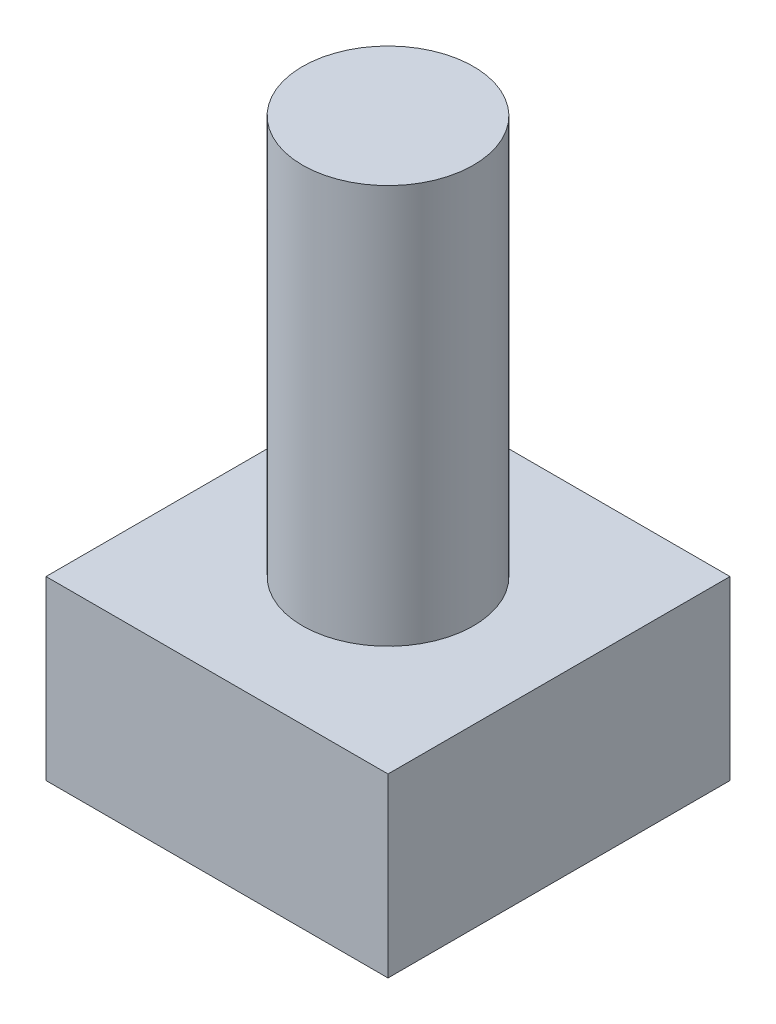
ISO-10303-21;
HEADER;
FILE_DESCRIPTION(('STEP AP214'),'2;1');
FILE_NAME('part.step','',(''),(''),'','','');
FILE_SCHEMA(('AUTOMOTIVE_DESIGN { 1 0 10303 214 1 1 1 1 }'));
ENDSEC;
DATA;
#1=APPLICATION_CONTEXT('core data for automotive mechanical design processes');
#2=APPLICATION_PROTOCOL_DEFINITION('international standard','automotive_design',2000,#1);
#3=PRODUCT_CONTEXT('',#1,'mechanical');
#4=PRODUCT('Part','Part','',(#3));
#5=PRODUCT_RELATED_PRODUCT_CATEGORY('part','',(#4));
#6=PRODUCT_DEFINITION_FORMATION('','',#4);
#7=PRODUCT_DEFINITION_CONTEXT('part definition',#1,'design');
#8=PRODUCT_DEFINITION('design','',#6,#7);
#9=PRODUCT_DEFINITION_SHAPE('','',#8);
#10=(LENGTH_UNIT() NAMED_UNIT(*) SI_UNIT(.MILLI.,.METRE.));
#11=(NAMED_UNIT(*) PLANE_ANGLE_UNIT() SI_UNIT($,.RADIAN.));
#12=(NAMED_UNIT(*) SI_UNIT($,.STERADIAN.) SOLID_ANGLE_UNIT());
#13=UNCERTAINTY_MEASURE_WITH_UNIT(LENGTH_MEASURE(1.E-05),#10,'distance_accuracy_value','');
#14=(GEOMETRIC_REPRESENTATION_CONTEXT(3) GLOBAL_UNCERTAINTY_ASSIGNED_CONTEXT((#13)) GLOBAL_UNIT_ASSIGNED_CONTEXT((#10,
#11,#12)) REPRESENTATION_CONTEXT('',''));
#15=CARTESIAN_POINT('',(0.,0.,0.));
#16=DIRECTION('',(0.,0.,1.));
#17=DIRECTION('',(1.,0.,0.));
#18=AXIS2_PLACEMENT_3D('',#15,#16,#17);
#19=CARTESIAN_POINT('',(-3.,3.1,2.99999999999999));
#20=DIRECTION('',(0.,1.,0.));
#21=DIRECTION('',(0.,0.,1.));
#22=AXIS2_PLACEMENT_3D('',#19,#20,#21);
#23=PLANE('',#22);
#24=DIRECTION('',(0.,0.,1.));
#25=VECTOR('',#24,1.);
#26=CARTESIAN_POINT('',(-3.,3.1,-3.00000000000001));
#27=LINE('',#26,#25);
#28=CARTESIAN_POINT('',(-3.,3.1,-3.00000000000001));
#29=VERTEX_POINT('',#28);
#30=CARTESIAN_POINT('',(-3.,3.1,2.99999999999999));
#31=VERTEX_POINT('',#30);
#32=EDGE_CURVE('E103',#29,#31,#27,.T.);
#33=ORIENTED_EDGE('',*,*,#32,.T.);
#34=DIRECTION('',(1.,0.,0.));
#35=VECTOR('',#34,1.);
#36=CARTESIAN_POINT('',(-3.,3.1,2.99999999999999));
#37=LINE('',#36,#35);
#38=CARTESIAN_POINT('',(3.00000000000002,3.1,2.99999999999999));
#39=VERTEX_POINT('',#38);
#40=EDGE_CURVE('E88',#31,#39,#37,.T.);
#41=ORIENTED_EDGE('',*,*,#40,.T.);
#42=DIRECTION('',(0.,0.,-1.));
#43=VECTOR('',#42,1.);
#44=CARTESIAN_POINT('',(3.,3.1,-3.00000000000001));
#45=LINE('',#44,#43);
#46=CARTESIAN_POINT('',(3.,3.1,-3.00000000000001));
#47=VERTEX_POINT('',#46);
#48=EDGE_CURVE('E55',#39,#47,#45,.T.);
#49=ORIENTED_EDGE('',*,*,#48,.T.);
#50=DIRECTION('',(-1.,0.,0.));
#51=VECTOR('',#50,1.);
#52=CARTESIAN_POINT('',(-3.,3.1,-3.00000000000001));
#53=LINE('',#52,#51);
#54=EDGE_CURVE('E50',#47,#29,#53,.T.);
#55=ORIENTED_EDGE('',*,*,#54,.T.);
#56=EDGE_LOOP('',(#33,#41,#49,#55));
#57=FACE_BOUND('',#56,.T.);
#58=CARTESIAN_POINT('',(0.,3.1,0.));
#59=DIRECTION('',(0.,1.,0.));
#60=DIRECTION('',(0.,0.,1.));
#61=AXIS2_PLACEMENT_3D('',#58,#59,#60);
#62=CIRCLE('',#61,1.5);
#63=CARTESIAN_POINT('',(0.,3.1,1.5));
#64=VERTEX_POINT('',#63);
#65=EDGE_CURVE('E96',#64,#64,#62,.T.);
#66=ORIENTED_EDGE('',*,*,#65,.F.);
#67=EDGE_LOOP('',(#66));
#68=FACE_BOUND('',#67,.T.);
#69=ADVANCED_FACE('F35',(#57,#68),#23,.T.);
#70=CARTESIAN_POINT('',(-3.,3.1,-3.00000000000001));
#71=DIRECTION('',(1.,0.,0.));
#72=DIRECTION('',(0.,0.,-1.));
#73=AXIS2_PLACEMENT_3D('',#70,#71,#72);
#74=PLANE('',#73);
#75=DIRECTION('',(0.,0.,1.));
#76=VECTOR('',#75,1.);
#77=CARTESIAN_POINT('',(-3.,0.,-3.00000000000001));
#78=LINE('',#77,#76);
#79=CARTESIAN_POINT('',(-3.,0.,-3.00000000000001));
#80=VERTEX_POINT('',#79);
#81=CARTESIAN_POINT('',(-3.,0.,2.99999999999999));
#82=VERTEX_POINT('',#81);
#83=EDGE_CURVE('E80',#80,#82,#78,.T.);
#84=ORIENTED_EDGE('',*,*,#83,.T.);
#85=DIRECTION('',(0.,-1.,0.));
#86=VECTOR('',#85,1.);
#87=CARTESIAN_POINT('',(-3.,3.1,2.99999999999999));
#88=LINE('',#87,#86);
#89=EDGE_CURVE('E11',#31,#82,#88,.T.);
#90=ORIENTED_EDGE('',*,*,#89,.F.);
#91=ORIENTED_EDGE('',*,*,#32,.F.);
#92=DIRECTION('',(0.,-1.,0.));
#93=VECTOR('',#92,1.);
#94=CARTESIAN_POINT('',(-3.,3.1,-3.00000000000001));
#95=LINE('',#94,#93);
#96=EDGE_CURVE('E92',#29,#80,#95,.T.);
#97=ORIENTED_EDGE('',*,*,#96,.T.);
#98=EDGE_LOOP('',(#84,#90,#91,#97));
#99=FACE_BOUND('',#98,.T.);
#100=ADVANCED_FACE('F37',(#99),#74,.F.);
#101=CARTESIAN_POINT('',(-3.,3.1,2.99999999999999));
#102=DIRECTION('',(0.,0.,-1.));
#103=DIRECTION('',(-1.,0.,0.));
#104=AXIS2_PLACEMENT_3D('',#101,#102,#103);
#105=PLANE('',#104);
#106=DIRECTION('',(1.,0.,0.));
#107=VECTOR('',#106,1.);
#108=CARTESIAN_POINT('',(-3.,0.,2.99999999999999));
#109=LINE('',#108,#107);
#110=CARTESIAN_POINT('',(3.00000000000002,0.,2.99999999999999));
#111=VERTEX_POINT('',#110);
#112=EDGE_CURVE('E76',#82,#111,#109,.T.);
#113=ORIENTED_EDGE('',*,*,#112,.T.);
#114=DIRECTION('',(0.,-1.,0.));
#115=VECTOR('',#114,1.);
#116=CARTESIAN_POINT('',(3.00000000000002,3.1,2.99999999999999));
#117=LINE('',#116,#115);
#118=EDGE_CURVE('E43',#39,#111,#117,.T.);
#119=ORIENTED_EDGE('',*,*,#118,.F.);
#120=ORIENTED_EDGE('',*,*,#40,.F.);
#121=ORIENTED_EDGE('',*,*,#89,.T.);
#122=EDGE_LOOP('',(#113,#119,#120,#121));
#123=FACE_BOUND('',#122,.T.);
#124=ADVANCED_FACE('F87',(#123),#105,.F.);
#125=CARTESIAN_POINT('',(3.,3.1,-3.00000000000001));
#126=DIRECTION('',(-1.,0.,0.));
#127=DIRECTION('',(0.,0.,1.));
#128=AXIS2_PLACEMENT_3D('',#125,#126,#127);
#129=PLANE('',#128);
#130=DIRECTION('',(0.,0.,-1.));
#131=VECTOR('',#130,1.);
#132=CARTESIAN_POINT('',(3.,0.,-3.00000000000001));
#133=LINE('',#132,#131);
#134=CARTESIAN_POINT('',(3.,0.,-3.00000000000001));
#135=VERTEX_POINT('',#134);
#136=EDGE_CURVE('E81',#111,#135,#133,.T.);
#137=ORIENTED_EDGE('',*,*,#136,.T.);
#138=DIRECTION('',(0.,-1.,0.));
#139=VECTOR('',#138,1.);
#140=CARTESIAN_POINT('',(3.,3.1,-3.00000000000001));
#141=LINE('',#140,#139);
#142=EDGE_CURVE('E109',#47,#135,#141,.T.);
#143=ORIENTED_EDGE('',*,*,#142,.F.);
#144=ORIENTED_EDGE('',*,*,#48,.F.);
#145=ORIENTED_EDGE('',*,*,#118,.T.);
#146=EDGE_LOOP('',(#137,#143,#144,#145));
#147=FACE_BOUND('',#146,.T.);
#148=ADVANCED_FACE('F112',(#147),#129,.F.);
#149=CARTESIAN_POINT('',(-3.,3.1,-3.00000000000001));
#150=DIRECTION('',(0.,0.,1.));
#151=DIRECTION('',(1.,0.,0.));
#152=AXIS2_PLACEMENT_3D('',#149,#150,#151);
#153=PLANE('',#152);
#154=DIRECTION('',(-1.,0.,0.));
#155=VECTOR('',#154,1.);
#156=CARTESIAN_POINT('',(-3.,0.,-3.00000000000001));
#157=LINE('',#156,#155);
#158=EDGE_CURVE('E101',#135,#80,#157,.T.);
#159=ORIENTED_EDGE('',*,*,#158,.T.);
#160=ORIENTED_EDGE('',*,*,#96,.F.);
#161=ORIENTED_EDGE('',*,*,#54,.F.);
#162=ORIENTED_EDGE('',*,*,#142,.T.);
#163=EDGE_LOOP('',(#159,#160,#161,#162));
#164=FACE_BOUND('',#163,.T.);
#165=ADVANCED_FACE('F114',(#164),#153,.F.);
#166=CARTESIAN_POINT('',(-3.,0.,2.99999999999999));
#167=DIRECTION('',(0.,1.,0.));
#168=DIRECTION('',(0.,0.,1.));
#169=AXIS2_PLACEMENT_3D('',#166,#167,#168);
#170=PLANE('',#169);
#171=ORIENTED_EDGE('',*,*,#83,.F.);
#172=ORIENTED_EDGE('',*,*,#158,.F.);
#173=ORIENTED_EDGE('',*,*,#136,.F.);
#174=ORIENTED_EDGE('',*,*,#112,.F.);
#175=EDGE_LOOP('',(#171,#172,#173,#174));
#176=FACE_BOUND('',#175,.T.);
#177=ADVANCED_FACE('F77',(#176),#170,.F.);
#178=CARTESIAN_POINT('',(0.,10.1,0.));
#179=DIRECTION('',(0.,-1.,0.));
#180=DIRECTION('',(0.,0.,-1.));
#181=AXIS2_PLACEMENT_3D('',#178,#179,#180);
#182=CYLINDRICAL_SURFACE('',#181,1.5);
#183=CARTESIAN_POINT('',(0.,10.1,0.));
#184=DIRECTION('',(0.,1.,0.));
#185=DIRECTION('',(0.,0.,1.));
#186=AXIS2_PLACEMENT_3D('',#183,#184,#185);
#187=CIRCLE('',#186,1.5);
#188=CARTESIAN_POINT('',(0.,10.1,1.5));
#189=VERTEX_POINT('',#188);
#190=EDGE_CURVE('E93',#189,#189,#187,.T.);
#191=ORIENTED_EDGE('',*,*,#190,.F.);
#192=EDGE_LOOP('',(#191));
#193=FACE_BOUND('',#192,.T.);
#194=ORIENTED_EDGE('',*,*,#65,.T.);
#195=EDGE_LOOP('',(#194));
#196=FACE_BOUND('',#195,.T.);
#197=ADVANCED_FACE('F121',(#193,#196),#182,.T.);
#198=CARTESIAN_POINT('',(0.,10.1,0.));
#199=DIRECTION('',(0.,1.,0.));
#200=DIRECTION('',(0.,0.,1.));
#201=AXIS2_PLACEMENT_3D('',#198,#199,#200);
#202=PLANE('',#201);
#203=ORIENTED_EDGE('',*,*,#190,.T.);
#204=EDGE_LOOP('',(#203));
#205=FACE_BOUND('',#204,.T.);
#206=ADVANCED_FACE('F123',(#205),#202,.T.);
#207=CLOSED_SHELL('',(#69,#100,#124,#148,#165,#177,#197,#206));
#208=MANIFOLD_SOLID_BREP('B2',#207);
#209=ADVANCED_BREP_SHAPE_REPRESENTATION('',(#18,#208),#14);
#210=SHAPE_DEFINITION_REPRESENTATION(#9,#209);
ENDSEC;
END-ISO-10303-21;
